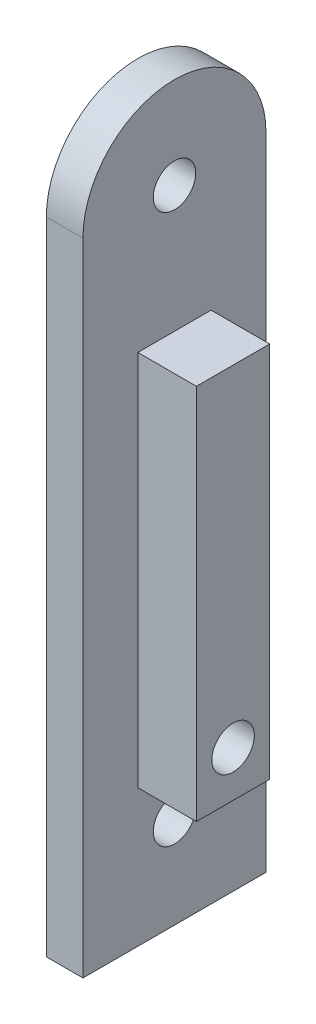
ISO-10303-21;
HEADER;
FILE_DESCRIPTION(('STEP AP214'),'2;1');
FILE_NAME('part.step','',(''),(''),'','','');
FILE_SCHEMA(('AUTOMOTIVE_DESIGN { 1 0 10303 214 1 1 1 1 }'));
ENDSEC;
DATA;
#1=APPLICATION_CONTEXT('core data for automotive mechanical design processes');
#2=APPLICATION_PROTOCOL_DEFINITION('international standard','automotive_design',2000,#1);
#3=PRODUCT_CONTEXT('',#1,'mechanical');
#4=PRODUCT('Part','Part','',(#3));
#5=PRODUCT_RELATED_PRODUCT_CATEGORY('part','',(#4));
#6=PRODUCT_DEFINITION_FORMATION('','',#4);
#7=PRODUCT_DEFINITION_CONTEXT('part definition',#1,'design');
#8=PRODUCT_DEFINITION('design','',#6,#7);
#9=PRODUCT_DEFINITION_SHAPE('','',#8);
#10=(LENGTH_UNIT() NAMED_UNIT(*) SI_UNIT(.MILLI.,.METRE.));
#11=(NAMED_UNIT(*) PLANE_ANGLE_UNIT() SI_UNIT($,.RADIAN.));
#12=(NAMED_UNIT(*) SI_UNIT($,.STERADIAN.) SOLID_ANGLE_UNIT());
#13=UNCERTAINTY_MEASURE_WITH_UNIT(LENGTH_MEASURE(1.E-05),#10,'distance_accuracy_value','');
#14=(GEOMETRIC_REPRESENTATION_CONTEXT(3) GLOBAL_UNCERTAINTY_ASSIGNED_CONTEXT((#13)) GLOBAL_UNIT_ASSIGNED_CONTEXT((#10,
#11,#12)) REPRESENTATION_CONTEXT('',''));
#15=CARTESIAN_POINT('',(0.,0.,0.));
#16=DIRECTION('',(0.,0.,1.));
#17=DIRECTION('',(1.,0.,0.));
#18=AXIS2_PLACEMENT_3D('',#15,#16,#17);
#19=CARTESIAN_POINT('',(2.54,0.,0.));
#20=DIRECTION('',(-1.,0.,0.));
#21=DIRECTION('',(0.,0.,1.));
#22=AXIS2_PLACEMENT_3D('',#19,#20,#21);
#23=PLANE('',#22);
#24=CARTESIAN_POINT('',(2.54,-38.1,0.));
#25=DIRECTION('',(-1.,0.,0.));
#26=DIRECTION('',(0.,0.,1.));
#27=AXIS2_PLACEMENT_3D('',#24,#25,#26);
#28=CIRCLE('',#27,1.4732);
#29=CARTESIAN_POINT('',(2.54,-38.1,1.4732));
#30=VERTEX_POINT('',#29);
#31=EDGE_CURVE('E40',#30,#30,#28,.T.);
#32=ORIENTED_EDGE('',*,*,#31,.T.);
#33=EDGE_LOOP('',(#32));
#34=FACE_BOUND('',#33,.T.);
#35=CARTESIAN_POINT('',(2.54,0.,0.));
#36=DIRECTION('',(-1.,0.,0.));
#37=DIRECTION('',(0.,0.,1.));
#38=AXIS2_PLACEMENT_3D('',#35,#36,#37);
#39=CIRCLE('',#38,1.4732);
#40=CARTESIAN_POINT('',(2.54,0.,1.4732));
#41=VERTEX_POINT('',#40);
#42=EDGE_CURVE('E121',#41,#41,#39,.T.);
#43=ORIENTED_EDGE('',*,*,#42,.T.);
#44=EDGE_LOOP('',(#43));
#45=FACE_BOUND('',#44,.T.);
#46=CARTESIAN_POINT('',(2.54,0.,0.));
#47=DIRECTION('',(1.,0.,0.));
#48=DIRECTION('',(0.,0.,1.));
#49=AXIS2_PLACEMENT_3D('',#46,#47,#48);
#50=CIRCLE('',#49,6.35);
#51=CARTESIAN_POINT('',(2.54,0.,-6.35));
#52=VERTEX_POINT('',#51);
#53=CARTESIAN_POINT('',(2.54,0.,6.35));
#54=VERTEX_POINT('',#53);
#55=EDGE_CURVE('E139',#52,#54,#50,.T.);
#56=ORIENTED_EDGE('',*,*,#55,.T.);
#57=DIRECTION('',(0.,-1.,0.));
#58=VECTOR('',#57,1.);
#59=CARTESIAN_POINT('',(2.54,0.,6.35));
#60=LINE('',#59,#58);
#61=CARTESIAN_POINT('',(2.54,-44.45,6.34999999999999));
#62=VERTEX_POINT('',#61);
#63=EDGE_CURVE('E142',#54,#62,#60,.T.);
#64=ORIENTED_EDGE('',*,*,#63,.T.);
#65=DIRECTION('',(0.,0.,-1.));
#66=VECTOR('',#65,1.);
#67=CARTESIAN_POINT('',(2.54,-44.45,6.34999999999999));
#68=LINE('',#67,#66);
#69=CARTESIAN_POINT('',(2.54,-44.45,-6.35));
#70=VERTEX_POINT('',#69);
#71=EDGE_CURVE('E145',#62,#70,#68,.T.);
#72=ORIENTED_EDGE('',*,*,#71,.T.);
#73=DIRECTION('',(0.,1.,0.));
#74=VECTOR('',#73,1.);
#75=CARTESIAN_POINT('',(2.54,-44.45,-6.35));
#76=LINE('',#75,#74);
#77=EDGE_CURVE('E147',#70,#52,#76,.T.);
#78=ORIENTED_EDGE('',*,*,#77,.T.);
#79=EDGE_LOOP('',(#56,#64,#72,#78));
#80=FACE_BOUND('',#79,.T.);
#81=DIRECTION('',(0.,-1.,0.));
#82=VECTOR('',#81,1.);
#83=CARTESIAN_POINT('',(2.54,-34.925,2.54));
#84=LINE('',#83,#82);
#85=CARTESIAN_POINT('',(2.54,-8.77229376718203,2.54));
#86=VERTEX_POINT('',#85);
#87=CARTESIAN_POINT('',(2.54,-34.925,2.54));
#88=VERTEX_POINT('',#87);
#89=EDGE_CURVE('E53',#86,#88,#84,.T.);
#90=ORIENTED_EDGE('',*,*,#89,.F.);
#91=DIRECTION('',(0.,0.,1.));
#92=VECTOR('',#91,1.);
#93=CARTESIAN_POINT('',(2.54,-8.77229376718203,2.54));
#94=LINE('',#93,#92);
#95=CARTESIAN_POINT('',(2.54,-8.77229376718203,-2.54));
#96=VERTEX_POINT('',#95);
#97=EDGE_CURVE('E58',#96,#86,#94,.T.);
#98=ORIENTED_EDGE('',*,*,#97,.F.);
#99=DIRECTION('',(0.,1.,0.));
#100=VECTOR('',#99,1.);
#101=CARTESIAN_POINT('',(2.54,-8.77229376718203,-2.54));
#102=LINE('',#101,#100);
#103=CARTESIAN_POINT('',(2.54,-34.925,-2.54));
#104=VERTEX_POINT('',#103);
#105=EDGE_CURVE('E100',#104,#96,#102,.T.);
#106=ORIENTED_EDGE('',*,*,#105,.F.);
#107=DIRECTION('',(0.,0.,-1.));
#108=VECTOR('',#107,1.);
#109=CARTESIAN_POINT('',(2.54,-34.925,-2.54));
#110=LINE('',#109,#108);
#111=EDGE_CURVE('E103',#88,#104,#110,.T.);
#112=ORIENTED_EDGE('',*,*,#111,.F.);
#113=EDGE_LOOP('',(#90,#98,#106,#112));
#114=FACE_BOUND('',#113,.T.);
#115=ADVANCED_FACE('F36',(#34,#45,#80,#114),#23,.F.);
#116=CARTESIAN_POINT('',(2.54,0.,0.));
#117=DIRECTION('',(-1.,0.,0.));
#118=DIRECTION('',(0.,0.,1.));
#119=AXIS2_PLACEMENT_3D('',#116,#117,#118);
#120=CYLINDRICAL_SURFACE('',#119,6.35);
#121=CARTESIAN_POINT('',(0.,0.,0.));
#122=DIRECTION('',(1.,0.,0.));
#123=DIRECTION('',(0.,0.,1.));
#124=AXIS2_PLACEMENT_3D('',#121,#122,#123);
#125=CIRCLE('',#124,6.35);
#126=CARTESIAN_POINT('',(0.,0.,-6.35));
#127=VERTEX_POINT('',#126);
#128=CARTESIAN_POINT('',(0.,0.,6.35));
#129=VERTEX_POINT('',#128);
#130=EDGE_CURVE('E150',#127,#129,#125,.T.);
#131=ORIENTED_EDGE('',*,*,#130,.T.);
#132=DIRECTION('',(-1.,0.,0.));
#133=VECTOR('',#132,1.);
#134=CARTESIAN_POINT('',(2.54,0.,6.35));
#135=LINE('',#134,#133);
#136=EDGE_CURVE('E11',#54,#129,#135,.T.);
#137=ORIENTED_EDGE('',*,*,#136,.F.);
#138=ORIENTED_EDGE('',*,*,#55,.F.);
#139=DIRECTION('',(-1.,0.,0.));
#140=VECTOR('',#139,1.);
#141=CARTESIAN_POINT('',(2.54,0.,-6.35));
#142=LINE('',#141,#140);
#143=EDGE_CURVE('E149',#52,#127,#142,.T.);
#144=ORIENTED_EDGE('',*,*,#143,.T.);
#145=EDGE_LOOP('',(#131,#137,#138,#144));
#146=FACE_BOUND('',#145,.T.);
#147=ADVANCED_FACE('F38',(#146),#120,.T.);
#148=CARTESIAN_POINT('',(2.54,0.,6.35));
#149=DIRECTION('',(0.,0.,-1.));
#150=DIRECTION('',(0.,1.,0.));
#151=AXIS2_PLACEMENT_3D('',#148,#149,#150);
#152=PLANE('',#151);
#153=DIRECTION('',(0.,-1.,0.));
#154=VECTOR('',#153,1.);
#155=CARTESIAN_POINT('',(0.,0.,6.35));
#156=LINE('',#155,#154);
#157=CARTESIAN_POINT('',(0.,-44.45,6.34999999999999));
#158=VERTEX_POINT('',#157);
#159=EDGE_CURVE('E153',#129,#158,#156,.T.);
#160=ORIENTED_EDGE('',*,*,#159,.T.);
#161=DIRECTION('',(-1.,0.,0.));
#162=VECTOR('',#161,1.);
#163=CARTESIAN_POINT('',(2.54,-44.45,6.34999999999999));
#164=LINE('',#163,#162);
#165=EDGE_CURVE('E45',#62,#158,#164,.T.);
#166=ORIENTED_EDGE('',*,*,#165,.F.);
#167=ORIENTED_EDGE('',*,*,#63,.F.);
#168=ORIENTED_EDGE('',*,*,#136,.T.);
#169=EDGE_LOOP('',(#160,#166,#167,#168));
#170=FACE_BOUND('',#169,.T.);
#171=ADVANCED_FACE('F206',(#170),#152,.F.);
#172=CARTESIAN_POINT('',(2.54,-44.45,6.34999999999999));
#173=DIRECTION('',(0.,1.,0.));
#174=DIRECTION('',(0.,0.,1.));
#175=AXIS2_PLACEMENT_3D('',#172,#173,#174);
#176=PLANE('',#175);
#177=DIRECTION('',(0.,0.,-1.));
#178=VECTOR('',#177,1.);
#179=CARTESIAN_POINT('',(0.,-44.45,6.34999999999999));
#180=LINE('',#179,#178);
#181=CARTESIAN_POINT('',(0.,-44.45,-6.35));
#182=VERTEX_POINT('',#181);
#183=EDGE_CURVE('E155',#158,#182,#180,.T.);
#184=ORIENTED_EDGE('',*,*,#183,.T.);
#185=DIRECTION('',(-1.,0.,0.));
#186=VECTOR('',#185,1.);
#187=CARTESIAN_POINT('',(2.54,-44.45,-6.35));
#188=LINE('',#187,#186);
#189=EDGE_CURVE('E160',#70,#182,#188,.T.);
#190=ORIENTED_EDGE('',*,*,#189,.F.);
#191=ORIENTED_EDGE('',*,*,#71,.F.);
#192=ORIENTED_EDGE('',*,*,#165,.T.);
#193=EDGE_LOOP('',(#184,#190,#191,#192));
#194=FACE_BOUND('',#193,.T.);
#195=ADVANCED_FACE('F218',(#194),#176,.F.);
#196=CARTESIAN_POINT('',(2.54,-44.45,-6.35));
#197=DIRECTION('',(0.,0.,1.));
#198=DIRECTION('',(1.,0.,0.));
#199=AXIS2_PLACEMENT_3D('',#196,#197,#198);
#200=PLANE('',#199);
#201=DIRECTION('',(0.,1.,0.));
#202=VECTOR('',#201,1.);
#203=CARTESIAN_POINT('',(0.,-44.45,-6.35));
#204=LINE('',#203,#202);
#205=EDGE_CURVE('E143',#182,#127,#204,.T.);
#206=ORIENTED_EDGE('',*,*,#205,.T.);
#207=ORIENTED_EDGE('',*,*,#143,.F.);
#208=ORIENTED_EDGE('',*,*,#77,.F.);
#209=ORIENTED_EDGE('',*,*,#189,.T.);
#210=EDGE_LOOP('',(#206,#207,#208,#209));
#211=FACE_BOUND('',#210,.T.);
#212=ADVANCED_FACE('F214',(#211),#200,.F.);
#213=CARTESIAN_POINT('',(0.,0.,0.));
#214=DIRECTION('',(-1.,0.,0.));
#215=DIRECTION('',(0.,0.,1.));
#216=AXIS2_PLACEMENT_3D('',#213,#214,#215);
#217=PLANE('',#216);
#218=CARTESIAN_POINT('',(0.,-31.75,0.));
#219=DIRECTION('',(-1.,0.,0.));
#220=DIRECTION('',(0.,0.,1.));
#221=AXIS2_PLACEMENT_3D('',#218,#219,#220);
#222=CIRCLE('',#221,1.4732);
#223=CARTESIAN_POINT('',(0.,-31.75,1.4732));
#224=VERTEX_POINT('',#223);
#225=EDGE_CURVE('E177',#224,#224,#222,.T.);
#226=ORIENTED_EDGE('',*,*,#225,.F.);
#227=EDGE_LOOP('',(#226));
#228=FACE_BOUND('',#227,.T.);
#229=CARTESIAN_POINT('',(0.,-38.1,0.));
#230=DIRECTION('',(-1.,0.,0.));
#231=DIRECTION('',(0.,0.,1.));
#232=AXIS2_PLACEMENT_3D('',#229,#230,#231);
#233=CIRCLE('',#232,1.4732);
#234=CARTESIAN_POINT('',(0.,-38.1,1.4732));
#235=VERTEX_POINT('',#234);
#236=EDGE_CURVE('E168',#235,#235,#233,.T.);
#237=ORIENTED_EDGE('',*,*,#236,.F.);
#238=EDGE_LOOP('',(#237));
#239=FACE_BOUND('',#238,.T.);
#240=CARTESIAN_POINT('',(0.,0.,0.));
#241=DIRECTION('',(-1.,0.,0.));
#242=DIRECTION('',(0.,0.,1.));
#243=AXIS2_PLACEMENT_3D('',#240,#241,#242);
#244=CIRCLE('',#243,1.4732);
#245=CARTESIAN_POINT('',(0.,0.,1.4732));
#246=VERTEX_POINT('',#245);
#247=EDGE_CURVE('E124',#246,#246,#244,.T.);
#248=ORIENTED_EDGE('',*,*,#247,.F.);
#249=EDGE_LOOP('',(#248));
#250=FACE_BOUND('',#249,.T.);
#251=ORIENTED_EDGE('',*,*,#130,.F.);
#252=ORIENTED_EDGE('',*,*,#205,.F.);
#253=ORIENTED_EDGE('',*,*,#183,.F.);
#254=ORIENTED_EDGE('',*,*,#159,.F.);
#255=EDGE_LOOP('',(#251,#252,#253,#254));
#256=FACE_BOUND('',#255,.T.);
#257=ADVANCED_FACE('F211',(#228,#239,#250,#256),#217,.T.);
#258=CARTESIAN_POINT('',(33.245517285997,-34.925,2.54));
#259=DIRECTION('',(0.,0.,-1.));
#260=DIRECTION('',(0.,1.,0.));
#261=AXIS2_PLACEMENT_3D('',#258,#259,#260);
#262=PLANE('',#261);
#263=DIRECTION('',(-1.,0.,0.));
#264=VECTOR('',#263,1.);
#265=CARTESIAN_POINT('',(33.245517285997,-34.925,2.54));
#266=LINE('',#265,#264);
#267=CARTESIAN_POINT('',(6.604,-34.925,2.54));
#268=VERTEX_POINT('',#267);
#269=EDGE_CURVE('E120',#268,#88,#266,.T.);
#270=ORIENTED_EDGE('',*,*,#269,.F.);
#271=DIRECTION('',(0.,1.,0.));
#272=VECTOR('',#271,1.);
#273=CARTESIAN_POINT('',(6.604,-34.925,2.54));
#274=LINE('',#273,#272);
#275=CARTESIAN_POINT('',(6.604,-8.77229376718203,2.54));
#276=VERTEX_POINT('',#275);
#277=EDGE_CURVE('E115',#268,#276,#274,.T.);
#278=ORIENTED_EDGE('',*,*,#277,.T.);
#279=DIRECTION('',(-1.,0.,0.));
#280=VECTOR('',#279,1.);
#281=CARTESIAN_POINT('',(33.245517285997,-8.77229376718203,2.54));
#282=LINE('',#281,#280);
#283=EDGE_CURVE('E133',#276,#86,#282,.T.);
#284=ORIENTED_EDGE('',*,*,#283,.T.);
#285=ORIENTED_EDGE('',*,*,#89,.T.);
#286=EDGE_LOOP('',(#270,#278,#284,#285));
#287=FACE_BOUND('',#286,.T.);
#288=ADVANCED_FACE('F184',(#287),#262,.F.);
#289=CARTESIAN_POINT('',(33.245517285997,-8.77229376718203,2.54));
#290=DIRECTION('',(0.,-1.,0.));
#291=DIRECTION('',(0.,0.,-1.));
#292=AXIS2_PLACEMENT_3D('',#289,#290,#291);
#293=PLANE('',#292);
#294=ORIENTED_EDGE('',*,*,#283,.F.);
#295=DIRECTION('',(0.,0.,-1.));
#296=VECTOR('',#295,1.);
#297=CARTESIAN_POINT('',(6.604,-8.77229376718203,2.54));
#298=LINE('',#297,#296);
#299=CARTESIAN_POINT('',(6.604,-8.77229376718203,-2.54));
#300=VERTEX_POINT('',#299);
#301=EDGE_CURVE('E138',#276,#300,#298,.T.);
#302=ORIENTED_EDGE('',*,*,#301,.T.);
#303=DIRECTION('',(-1.,0.,0.));
#304=VECTOR('',#303,1.);
#305=CARTESIAN_POINT('',(33.245517285997,-8.77229376718203,-2.54));
#306=LINE('',#305,#304);
#307=EDGE_CURVE('E116',#300,#96,#306,.T.);
#308=ORIENTED_EDGE('',*,*,#307,.T.);
#309=ORIENTED_EDGE('',*,*,#97,.T.);
#310=EDGE_LOOP('',(#294,#302,#308,#309));
#311=FACE_BOUND('',#310,.T.);
#312=ADVANCED_FACE('F187',(#311),#293,.F.);
#313=CARTESIAN_POINT('',(33.245517285997,-8.77229376718203,-2.54));
#314=DIRECTION('',(0.,0.,1.));
#315=DIRECTION('',(0.,-1.,0.));
#316=AXIS2_PLACEMENT_3D('',#313,#314,#315);
#317=PLANE('',#316);
#318=ORIENTED_EDGE('',*,*,#307,.F.);
#319=DIRECTION('',(0.,-1.,0.));
#320=VECTOR('',#319,1.);
#321=CARTESIAN_POINT('',(6.604,-8.77229376718203,-2.54));
#322=LINE('',#321,#320);
#323=CARTESIAN_POINT('',(6.604,-34.925,-2.54));
#324=VERTEX_POINT('',#323);
#325=EDGE_CURVE('E112',#300,#324,#322,.T.);
#326=ORIENTED_EDGE('',*,*,#325,.T.);
#327=DIRECTION('',(-1.,0.,0.));
#328=VECTOR('',#327,1.);
#329=CARTESIAN_POINT('',(33.245517285997,-34.925,-2.54));
#330=LINE('',#329,#328);
#331=EDGE_CURVE('E110',#324,#104,#330,.T.);
#332=ORIENTED_EDGE('',*,*,#331,.T.);
#333=ORIENTED_EDGE('',*,*,#105,.T.);
#334=EDGE_LOOP('',(#318,#326,#332,#333));
#335=FACE_BOUND('',#334,.T.);
#336=ADVANCED_FACE('F111',(#335),#317,.F.);
#337=CARTESIAN_POINT('',(33.245517285997,-34.925,-2.54));
#338=DIRECTION('',(0.,1.,0.));
#339=DIRECTION('',(0.,0.,1.));
#340=AXIS2_PLACEMENT_3D('',#337,#338,#339);
#341=PLANE('',#340);
#342=ORIENTED_EDGE('',*,*,#331,.F.);
#343=DIRECTION('',(0.,0.,1.));
#344=VECTOR('',#343,1.);
#345=CARTESIAN_POINT('',(6.604,-34.925,-2.54));
#346=LINE('',#345,#344);
#347=EDGE_CURVE('E127',#324,#268,#346,.T.);
#348=ORIENTED_EDGE('',*,*,#347,.T.);
#349=ORIENTED_EDGE('',*,*,#269,.T.);
#350=ORIENTED_EDGE('',*,*,#111,.T.);
#351=EDGE_LOOP('',(#342,#348,#349,#350));
#352=FACE_BOUND('',#351,.T.);
#353=ADVANCED_FACE('F118',(#352),#341,.F.);
#354=CARTESIAN_POINT('',(6.604,0.,0.));
#355=DIRECTION('',(-1.,0.,0.));
#356=DIRECTION('',(0.,0.,1.));
#357=AXIS2_PLACEMENT_3D('',#354,#355,#356);
#358=PLANE('',#357);
#359=CARTESIAN_POINT('',(6.604,-31.75,0.));
#360=DIRECTION('',(-1.,0.,0.));
#361=DIRECTION('',(0.,0.,1.));
#362=AXIS2_PLACEMENT_3D('',#359,#360,#361);
#363=CIRCLE('',#362,1.4732);
#364=CARTESIAN_POINT('',(6.604,-31.75,1.4732));
#365=VERTEX_POINT('',#364);
#366=EDGE_CURVE('E172',#365,#365,#363,.T.);
#367=ORIENTED_EDGE('',*,*,#366,.T.);
#368=EDGE_LOOP('',(#367));
#369=FACE_BOUND('',#368,.T.);
#370=ORIENTED_EDGE('',*,*,#325,.F.);
#371=ORIENTED_EDGE('',*,*,#301,.F.);
#372=ORIENTED_EDGE('',*,*,#277,.F.);
#373=ORIENTED_EDGE('',*,*,#347,.F.);
#374=EDGE_LOOP('',(#370,#371,#372,#373));
#375=FACE_BOUND('',#374,.T.);
#376=ADVANCED_FACE('F188',(#369,#375),#358,.F.);
#377=CARTESIAN_POINT('',(6.604,0.,0.));
#378=DIRECTION('',(-1.,0.,0.));
#379=DIRECTION('',(0.,0.,1.));
#380=AXIS2_PLACEMENT_3D('',#377,#378,#379);
#381=CYLINDRICAL_SURFACE('',#380,1.4732);
#382=ORIENTED_EDGE('',*,*,#247,.T.);
#383=EDGE_LOOP('',(#382));
#384=FACE_BOUND('',#383,.T.);
#385=ORIENTED_EDGE('',*,*,#42,.F.);
#386=EDGE_LOOP('',(#385));
#387=FACE_BOUND('',#386,.T.);
#388=ADVANCED_FACE('F190',(#384,#387),#381,.F.);
#389=CARTESIAN_POINT('',(0.,-38.1,0.));
#390=DIRECTION('',(-1.,0.,0.));
#391=DIRECTION('',(0.,0.,1.));
#392=AXIS2_PLACEMENT_3D('',#389,#390,#391);
#393=CYLINDRICAL_SURFACE('',#392,1.4732);
#394=ORIENTED_EDGE('',*,*,#236,.T.);
#395=EDGE_LOOP('',(#394));
#396=FACE_BOUND('',#395,.T.);
#397=ORIENTED_EDGE('',*,*,#31,.F.);
#398=EDGE_LOOP('',(#397));
#399=FACE_BOUND('',#398,.T.);
#400=ADVANCED_FACE('F197',(#396,#399),#393,.F.);
#401=CARTESIAN_POINT('',(0.,-31.75,0.));
#402=DIRECTION('',(-1.,0.,0.));
#403=DIRECTION('',(0.,0.,1.));
#404=AXIS2_PLACEMENT_3D('',#401,#402,#403);
#405=CYLINDRICAL_SURFACE('',#404,1.4732);
#406=ORIENTED_EDGE('',*,*,#366,.F.);
#407=EDGE_LOOP('',(#406));
#408=FACE_BOUND('',#407,.T.);
#409=ORIENTED_EDGE('',*,*,#225,.T.);
#410=EDGE_LOOP('',(#409));
#411=FACE_BOUND('',#410,.T.);
#412=ADVANCED_FACE('F310',(#408,#411),#405,.F.);
#413=CLOSED_SHELL('',(#115,#147,#171,#195,#212,#257,#288,#312,#336,#353,#376,#388,#400,#412));
#414=MANIFOLD_SOLID_BREP('B2',#413);
#415=ADVANCED_BREP_SHAPE_REPRESENTATION('',(#18,#414),#14);
#416=SHAPE_DEFINITION_REPRESENTATION(#9,#415);
ENDSEC;
END-ISO-10303-21;
